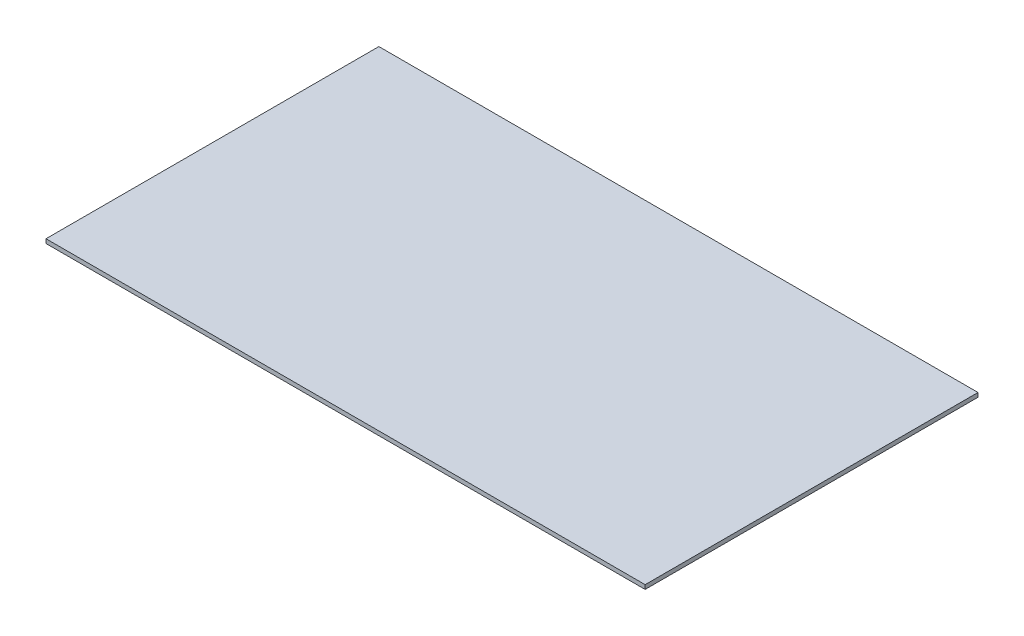
ISO-10303-21;
HEADER;
FILE_DESCRIPTION(('STEP AP214'),'2;1');
FILE_NAME('part.step','',(''),(''),'','','');
FILE_SCHEMA(('AUTOMOTIVE_DESIGN { 1 0 10303 214 1 1 1 1 }'));
ENDSEC;
DATA;
#1=APPLICATION_CONTEXT('core data for automotive mechanical design processes');
#2=APPLICATION_PROTOCOL_DEFINITION('international standard','automotive_design',2000,#1);
#3=PRODUCT_CONTEXT('',#1,'mechanical');
#4=PRODUCT('Part','Part','',(#3));
#5=PRODUCT_RELATED_PRODUCT_CATEGORY('part','',(#4));
#6=PRODUCT_DEFINITION_FORMATION('','',#4);
#7=PRODUCT_DEFINITION_CONTEXT('part definition',#1,'design');
#8=PRODUCT_DEFINITION('design','',#6,#7);
#9=PRODUCT_DEFINITION_SHAPE('','',#8);
#10=(LENGTH_UNIT() NAMED_UNIT(*) SI_UNIT(.MILLI.,.METRE.));
#11=(NAMED_UNIT(*) PLANE_ANGLE_UNIT() SI_UNIT($,.RADIAN.));
#12=(NAMED_UNIT(*) SI_UNIT($,.STERADIAN.) SOLID_ANGLE_UNIT());
#13=UNCERTAINTY_MEASURE_WITH_UNIT(LENGTH_MEASURE(1.E-05),#10,'distance_accuracy_value','');
#14=(GEOMETRIC_REPRESENTATION_CONTEXT(3) GLOBAL_UNCERTAINTY_ASSIGNED_CONTEXT((#13)) GLOBAL_UNIT_ASSIGNED_CONTEXT((#10,
#11,#12)) REPRESENTATION_CONTEXT('',''));
#15=CARTESIAN_POINT('',(0.,0.,0.));
#16=DIRECTION('',(0.,0.,1.));
#17=DIRECTION('',(1.,0.,0.));
#18=AXIS2_PLACEMENT_3D('',#15,#16,#17);
#19=CARTESIAN_POINT('',(457.2,6.35,-254.));
#20=DIRECTION('',(-1.,0.,0.));
#21=DIRECTION('',(0.,0.,1.));
#22=AXIS2_PLACEMENT_3D('',#19,#20,#21);
#23=PLANE('',#22);
#24=DIRECTION('',(0.,0.,-1.));
#25=VECTOR('',#24,1.);
#26=CARTESIAN_POINT('',(457.2,0.,-254.));
#27=LINE('',#26,#25);
#28=CARTESIAN_POINT('',(457.2,0.,254.));
#29=VERTEX_POINT('',#28);
#30=CARTESIAN_POINT('',(457.2,0.,-254.));
#31=VERTEX_POINT('',#30);
#32=EDGE_CURVE('E102',#29,#31,#27,.T.);
#33=ORIENTED_EDGE('',*,*,#32,.T.);
#34=DIRECTION('',(0.,-1.,0.));
#35=VECTOR('',#34,1.);
#36=CARTESIAN_POINT('',(457.2,6.35,-254.));
#37=LINE('',#36,#35);
#38=CARTESIAN_POINT('',(457.2,6.35,-254.));
#39=VERTEX_POINT('',#38);
#40=EDGE_CURVE('E11',#39,#31,#37,.T.);
#41=ORIENTED_EDGE('',*,*,#40,.F.);
#42=DIRECTION('',(0.,0.,-1.));
#43=VECTOR('',#42,1.);
#44=CARTESIAN_POINT('',(457.2,6.35,-254.));
#45=LINE('',#44,#43);
#46=CARTESIAN_POINT('',(457.2,6.35,254.));
#47=VERTEX_POINT('',#46);
#48=EDGE_CURVE('E90',#47,#39,#45,.T.);
#49=ORIENTED_EDGE('',*,*,#48,.F.);
#50=DIRECTION('',(0.,-1.,0.));
#51=VECTOR('',#50,1.);
#52=CARTESIAN_POINT('',(457.2,6.35,254.));
#53=LINE('',#52,#51);
#54=EDGE_CURVE('E98',#47,#29,#53,.T.);
#55=ORIENTED_EDGE('',*,*,#54,.T.);
#56=EDGE_LOOP('',(#33,#41,#49,#55));
#57=FACE_BOUND('',#56,.T.);
#58=ADVANCED_FACE('F39',(#57),#23,.F.);
#59=CARTESIAN_POINT('',(-457.2,6.35,-254.));
#60=DIRECTION('',(0.,0.,1.));
#61=DIRECTION('',(1.,0.,0.));
#62=AXIS2_PLACEMENT_3D('',#59,#60,#61);
#63=PLANE('',#62);
#64=DIRECTION('',(-1.,0.,0.));
#65=VECTOR('',#64,1.);
#66=CARTESIAN_POINT('',(-457.2,0.,-254.));
#67=LINE('',#66,#65);
#68=CARTESIAN_POINT('',(-457.2,0.,-254.));
#69=VERTEX_POINT('',#68);
#70=EDGE_CURVE('E94',#31,#69,#67,.T.);
#71=ORIENTED_EDGE('',*,*,#70,.T.);
#72=DIRECTION('',(0.,-1.,0.));
#73=VECTOR('',#72,1.);
#74=CARTESIAN_POINT('',(-457.2,6.35,-254.));
#75=LINE('',#74,#73);
#76=CARTESIAN_POINT('',(-457.2,6.35,-254.));
#77=VERTEX_POINT('',#76);
#78=EDGE_CURVE('E47',#77,#69,#75,.T.);
#79=ORIENTED_EDGE('',*,*,#78,.F.);
#80=DIRECTION('',(-1.,0.,0.));
#81=VECTOR('',#80,1.);
#82=CARTESIAN_POINT('',(-457.2,6.35,-254.));
#83=LINE('',#82,#81);
#84=EDGE_CURVE('E85',#39,#77,#83,.T.);
#85=ORIENTED_EDGE('',*,*,#84,.F.);
#86=ORIENTED_EDGE('',*,*,#40,.T.);
#87=EDGE_LOOP('',(#71,#79,#85,#86));
#88=FACE_BOUND('',#87,.T.);
#89=ADVANCED_FACE('F93',(#88),#63,.F.);
#90=CARTESIAN_POINT('',(-457.2,6.35,-254.));
#91=DIRECTION('',(1.,0.,0.));
#92=DIRECTION('',(0.,0.,-1.));
#93=AXIS2_PLACEMENT_3D('',#90,#91,#92);
#94=PLANE('',#93);
#95=DIRECTION('',(0.,0.,1.));
#96=VECTOR('',#95,1.);
#97=CARTESIAN_POINT('',(-457.2,0.,-254.));
#98=LINE('',#97,#96);
#99=CARTESIAN_POINT('',(-457.2,0.,254.));
#100=VERTEX_POINT('',#99);
#101=EDGE_CURVE('E72',#69,#100,#98,.T.);
#102=ORIENTED_EDGE('',*,*,#101,.T.);
#103=DIRECTION('',(0.,-1.,0.));
#104=VECTOR('',#103,1.);
#105=CARTESIAN_POINT('',(-457.2,6.35,254.));
#106=LINE('',#105,#104);
#107=CARTESIAN_POINT('',(-457.2,6.35,254.));
#108=VERTEX_POINT('',#107);
#109=EDGE_CURVE('E95',#108,#100,#106,.T.);
#110=ORIENTED_EDGE('',*,*,#109,.F.);
#111=DIRECTION('',(0.,0.,1.));
#112=VECTOR('',#111,1.);
#113=CARTESIAN_POINT('',(-457.2,6.35,-254.));
#114=LINE('',#113,#112);
#115=EDGE_CURVE('E88',#77,#108,#114,.T.);
#116=ORIENTED_EDGE('',*,*,#115,.F.);
#117=ORIENTED_EDGE('',*,*,#78,.T.);
#118=EDGE_LOOP('',(#102,#110,#116,#117));
#119=FACE_BOUND('',#118,.T.);
#120=ADVANCED_FACE('F96',(#119),#94,.F.);
#121=CARTESIAN_POINT('',(-457.2,6.35,254.));
#122=DIRECTION('',(0.,0.,-1.));
#123=DIRECTION('',(-1.,0.,0.));
#124=AXIS2_PLACEMENT_3D('',#121,#122,#123);
#125=PLANE('',#124);
#126=DIRECTION('',(1.,0.,0.));
#127=VECTOR('',#126,1.);
#128=CARTESIAN_POINT('',(-457.2,0.,254.));
#129=LINE('',#128,#127);
#130=EDGE_CURVE('E78',#100,#29,#129,.T.);
#131=ORIENTED_EDGE('',*,*,#130,.T.);
#132=ORIENTED_EDGE('',*,*,#54,.F.);
#133=DIRECTION('',(1.,0.,0.));
#134=VECTOR('',#133,1.);
#135=CARTESIAN_POINT('',(-457.2,6.35,254.));
#136=LINE('',#135,#134);
#137=EDGE_CURVE('E55',#108,#47,#136,.T.);
#138=ORIENTED_EDGE('',*,*,#137,.F.);
#139=ORIENTED_EDGE('',*,*,#109,.T.);
#140=EDGE_LOOP('',(#131,#132,#138,#139));
#141=FACE_BOUND('',#140,.T.);
#142=ADVANCED_FACE('F109',(#141),#125,.F.);
#143=CARTESIAN_POINT('',(0.,6.35,0.));
#144=DIRECTION('',(0.,1.,0.));
#145=DIRECTION('',(0.,0.,1.));
#146=AXIS2_PLACEMENT_3D('',#143,#144,#145);
#147=PLANE('',#146);
#148=ORIENTED_EDGE('',*,*,#48,.T.);
#149=ORIENTED_EDGE('',*,*,#84,.T.);
#150=ORIENTED_EDGE('',*,*,#115,.T.);
#151=ORIENTED_EDGE('',*,*,#137,.T.);
#152=EDGE_LOOP('',(#148,#149,#150,#151));
#153=FACE_BOUND('',#152,.T.);
#154=ADVANCED_FACE('F86',(#153),#147,.T.);
#155=CARTESIAN_POINT('',(0.,0.,0.));
#156=DIRECTION('',(0.,1.,0.));
#157=DIRECTION('',(0.,0.,1.));
#158=AXIS2_PLACEMENT_3D('',#155,#156,#157);
#159=PLANE('',#158);
#160=ORIENTED_EDGE('',*,*,#32,.F.);
#161=ORIENTED_EDGE('',*,*,#130,.F.);
#162=ORIENTED_EDGE('',*,*,#101,.F.);
#163=ORIENTED_EDGE('',*,*,#70,.F.);
#164=EDGE_LOOP('',(#160,#161,#162,#163));
#165=FACE_BOUND('',#164,.T.);
#166=ADVANCED_FACE('F112',(#165),#159,.F.);
#167=CLOSED_SHELL('',(#58,#89,#120,#142,#154,#166));
#168=MANIFOLD_SOLID_BREP('B2',#167);
#169=ADVANCED_BREP_SHAPE_REPRESENTATION('',(#18,#168),#14);
#170=SHAPE_DEFINITION_REPRESENTATION(#9,#169);
ENDSEC;
END-ISO-10303-21;
